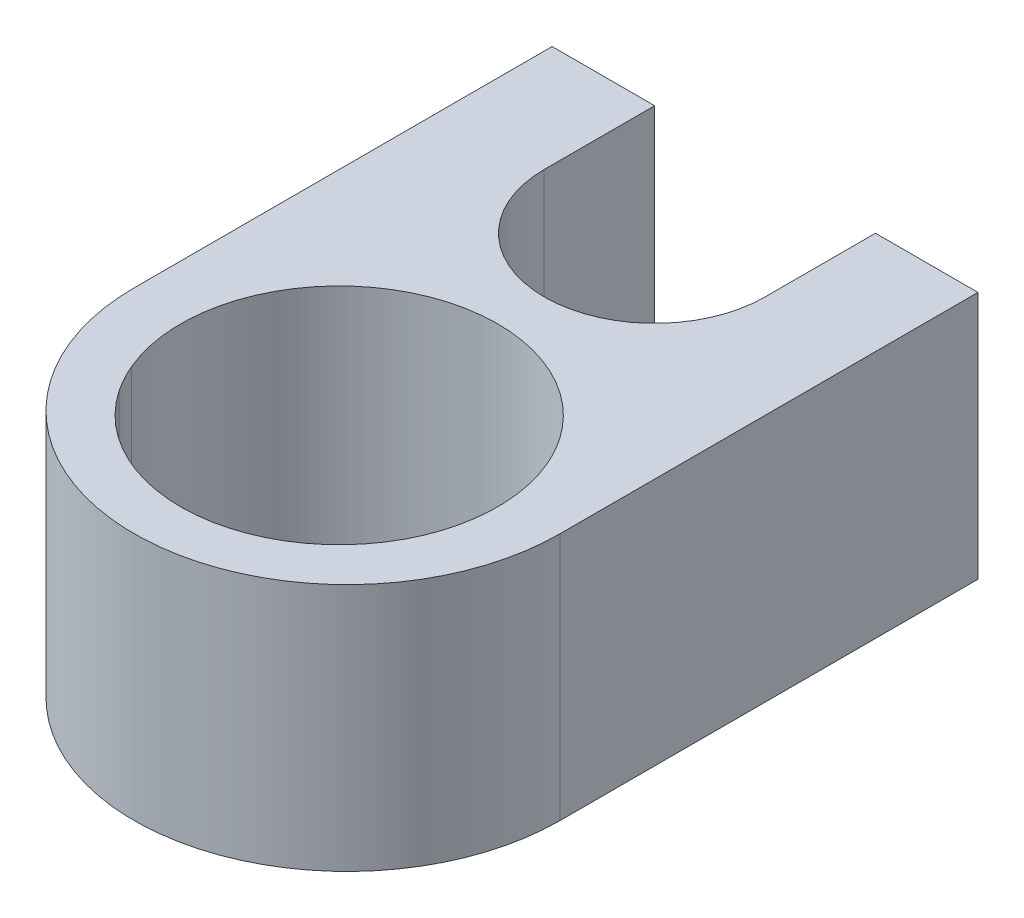
ISO-10303-21;
HEADER;
FILE_DESCRIPTION(('STEP AP214'),'2;1');
FILE_NAME('part.step','',(''),(''),'','','');
FILE_SCHEMA(('AUTOMOTIVE_DESIGN { 1 0 10303 214 1 1 1 1 }'));
ENDSEC;
DATA;
#1=APPLICATION_CONTEXT('core data for automotive mechanical design processes');
#2=APPLICATION_PROTOCOL_DEFINITION('international standard','automotive_design',2000,#1);
#3=PRODUCT_CONTEXT('',#1,'mechanical');
#4=PRODUCT('Part','Part','',(#3));
#5=PRODUCT_RELATED_PRODUCT_CATEGORY('part','',(#4));
#6=PRODUCT_DEFINITION_FORMATION('','',#4);
#7=PRODUCT_DEFINITION_CONTEXT('part definition',#1,'design');
#8=PRODUCT_DEFINITION('design','',#6,#7);
#9=PRODUCT_DEFINITION_SHAPE('','',#8);
#10=(LENGTH_UNIT() NAMED_UNIT(*) SI_UNIT(.MILLI.,.METRE.));
#11=(NAMED_UNIT(*) PLANE_ANGLE_UNIT() SI_UNIT($,.RADIAN.));
#12=(NAMED_UNIT(*) SI_UNIT($,.STERADIAN.) SOLID_ANGLE_UNIT());
#13=UNCERTAINTY_MEASURE_WITH_UNIT(LENGTH_MEASURE(1.E-05),#10,'distance_accuracy_value','');
#14=(GEOMETRIC_REPRESENTATION_CONTEXT(3) GLOBAL_UNCERTAINTY_ASSIGNED_CONTEXT((#13)) GLOBAL_UNIT_ASSIGNED_CONTEXT((#10,
#11,#12)) REPRESENTATION_CONTEXT('',''));
#15=CARTESIAN_POINT('',(0.,0.,0.));
#16=DIRECTION('',(0.,0.,1.));
#17=DIRECTION('',(1.,0.,0.));
#18=AXIS2_PLACEMENT_3D('',#15,#16,#17);
#19=CARTESIAN_POINT('',(0.,15.75,19.));
#20=DIRECTION('',(0.,-1.,0.));
#21=DIRECTION('',(0.,0.,-1.));
#22=AXIS2_PLACEMENT_3D('',#19,#20,#21);
#23=CYLINDRICAL_SURFACE('',#22,20.1);
#24=DIRECTION('',(0.,-1.,0.));
#25=VECTOR('',#24,1.);
#26=CARTESIAN_POINT('',(-16.6027744372895,15.75,30.3295137135045));
#27=LINE('',#26,#25);
#28=CARTESIAN_POINT('',(-16.6027744372896,-15.75,30.3295137135044));
#29=VERTEX_POINT('',#28);
#30=CARTESIAN_POINT('',(-16.6027744372896,15.75,30.3295137135044));
#31=VERTEX_POINT('',#30);
#32=EDGE_CURVE('E11',#29,#31,#27,.F.);
#33=ORIENTED_EDGE('',*,*,#32,.F.);
#34=CARTESIAN_POINT('',(0.,-15.75,19.));
#35=DIRECTION('',(0.,-1.,0.));
#36=DIRECTION('',(0.,0.,-1.));
#37=AXIS2_PLACEMENT_3D('',#34,#35,#36);
#38=CIRCLE('',#37,20.1);
#39=CARTESIAN_POINT('',(-18.5194079123365,-15.75,26.8129079462444));
#40=VERTEX_POINT('',#39);
#41=EDGE_CURVE('E383',#29,#40,#38,.T.);
#42=ORIENTED_EDGE('',*,*,#41,.T.);
#43=DIRECTION('',(0.,-1.,0.));
#44=VECTOR('',#43,1.);
#45=CARTESIAN_POINT('',(-18.5194079123365,15.75,26.8129079462444));
#46=LINE('',#45,#44);
#47=CARTESIAN_POINT('',(-18.5194079123365,15.75,26.8129079462444));
#48=VERTEX_POINT('',#47);
#49=EDGE_CURVE('E50',#48,#40,#46,.T.);
#50=ORIENTED_EDGE('',*,*,#49,.F.);
#51=CARTESIAN_POINT('',(0.,15.75,19.));
#52=DIRECTION('',(0.,-1.,0.));
#53=DIRECTION('',(0.,0.,-1.));
#54=AXIS2_PLACEMENT_3D('',#51,#52,#53);
#55=CIRCLE('',#54,20.1);
#56=EDGE_CURVE('E216',#31,#48,#55,.T.);
#57=ORIENTED_EDGE('',*,*,#56,.F.);
#58=EDGE_LOOP('',(#33,#42,#50,#57));
#59=FACE_BOUND('',#58,.T.);
#60=ADVANCED_FACE('F40',(#59),#23,.F.);
#61=CARTESIAN_POINT('',(18.5194079123366,-15.75,11.1870920537559));
#62=VERTEX_POINT('',#61);
#63=EDGE_CURVE('E226',#62,#29,#38,.T.);
#64=ORIENTED_EDGE('',*,*,#63,.T.);
#65=ORIENTED_EDGE('',*,*,#32,.T.);
#66=CARTESIAN_POINT('',(18.5194079123366,15.75,11.1870920537559));
#67=VERTEX_POINT('',#66);
#68=EDGE_CURVE('E222',#67,#31,#55,.T.);
#69=ORIENTED_EDGE('',*,*,#68,.F.);
#70=DIRECTION('',(0.,-1.,0.));
#71=VECTOR('',#70,1.);
#72=CARTESIAN_POINT('',(18.5194079123366,15.75,11.1870920537559));
#73=LINE('',#72,#71);
#74=EDGE_CURVE('E189',#67,#62,#73,.T.);
#75=ORIENTED_EDGE('',*,*,#74,.T.);
#76=EDGE_LOOP('',(#64,#65,#69,#75));
#77=FACE_BOUND('',#76,.T.);
#78=ADVANCED_FACE('F270',(#77),#23,.F.);
#79=DIRECTION('',(0.,-1.,0.));
#80=VECTOR('',#79,1.);
#81=CARTESIAN_POINT('',(16.6027744372894,15.75,7.67048628649537));
#82=LINE('',#81,#80);
#83=CARTESIAN_POINT('',(16.6027744372894,-15.75,7.67048628649536));
#84=VERTEX_POINT('',#83);
#85=CARTESIAN_POINT('',(16.6027744372894,15.75,7.67048628649536));
#86=VERTEX_POINT('',#85);
#87=EDGE_CURVE('E192',#84,#86,#82,.F.);
#88=ORIENTED_EDGE('',*,*,#87,.F.);
#89=EDGE_CURVE('E217',#84,#62,#38,.T.);
#90=ORIENTED_EDGE('',*,*,#89,.T.);
#91=ORIENTED_EDGE('',*,*,#74,.F.);
#92=EDGE_CURVE('E215',#86,#67,#55,.T.);
#93=ORIENTED_EDGE('',*,*,#92,.F.);
#94=EDGE_LOOP('',(#88,#90,#91,#93));
#95=FACE_BOUND('',#94,.T.);
#96=ADVANCED_FACE('F219',(#95),#23,.F.);
#97=CARTESIAN_POINT('',(0.,-15.75,18.));
#98=DIRECTION('',(0.,-1.,0.));
#99=DIRECTION('',(0.,0.,-1.));
#100=AXIS2_PLACEMENT_3D('',#97,#98,#99);
#101=CYLINDRICAL_SURFACE('',#100,27.);
#102=DIRECTION('',(0.,-1.,0.));
#103=VECTOR('',#102,1.);
#104=CARTESIAN_POINT('',(-27.,-15.75,18.));
#105=LINE('',#104,#103);
#106=CARTESIAN_POINT('',(-27.,-15.75,18.));
#107=VERTEX_POINT('',#106);
#108=CARTESIAN_POINT('',(-27.,15.75,18.));
#109=VERTEX_POINT('',#108);
#110=EDGE_CURVE('E179',#107,#109,#105,.F.);
#111=ORIENTED_EDGE('',*,*,#110,.F.);
#112=CARTESIAN_POINT('',(0.,-15.75,18.));
#113=DIRECTION('',(0.,1.,0.));
#114=DIRECTION('',(0.,0.,1.));
#115=AXIS2_PLACEMENT_3D('',#112,#113,#114);
#116=CIRCLE('',#115,27.);
#117=CARTESIAN_POINT('',(27.,-15.75,18.));
#118=VERTEX_POINT('',#117);
#119=EDGE_CURVE('E185',#118,#107,#116,.F.);
#120=ORIENTED_EDGE('',*,*,#119,.F.);
#121=DIRECTION('',(0.,-1.,0.));
#122=VECTOR('',#121,1.);
#123=CARTESIAN_POINT('',(27.,-15.75,18.));
#124=LINE('',#123,#122);
#125=CARTESIAN_POINT('',(27.,15.75,18.));
#126=VERTEX_POINT('',#125);
#127=EDGE_CURVE('E182',#126,#118,#124,.T.);
#128=ORIENTED_EDGE('',*,*,#127,.F.);
#129=CARTESIAN_POINT('',(0.,15.75,18.));
#130=DIRECTION('',(0.,-1.,0.));
#131=DIRECTION('',(0.,0.,-1.));
#132=AXIS2_PLACEMENT_3D('',#129,#130,#131);
#133=CIRCLE('',#132,27.);
#134=EDGE_CURVE('E187',#109,#126,#133,.F.);
#135=ORIENTED_EDGE('',*,*,#134,.F.);
#136=EDGE_LOOP('',(#111,#120,#128,#135));
#137=FACE_BOUND('',#136,.T.);
#138=ADVANCED_FACE('F43',(#137),#101,.T.);
#139=CARTESIAN_POINT('',(-27.,15.75,45.));
#140=DIRECTION('',(0.,-1.,0.));
#141=DIRECTION('',(0.,0.,-1.));
#142=AXIS2_PLACEMENT_3D('',#139,#140,#141);
#143=PLANE('',#142);
#144=ORIENTED_EDGE('',*,*,#92,.T.);
#145=ORIENTED_EDGE('',*,*,#68,.T.);
#146=ORIENTED_EDGE('',*,*,#56,.T.);
#147=EDGE_CURVE('E205',#48,#86,#55,.T.);
#148=ORIENTED_EDGE('',*,*,#147,.T.);
#149=EDGE_LOOP('',(#144,#145,#146,#148));
#150=FACE_BOUND('',#149,.T.);
#151=DIRECTION('',(0.,0.,-1.));
#152=VECTOR('',#151,1.);
#153=CARTESIAN_POINT('',(-27.,15.75,45.));
#154=LINE('',#153,#152);
#155=CARTESIAN_POINT('',(-27.,15.75,-35.));
#156=VERTEX_POINT('',#155);
#157=EDGE_CURVE('E175',#109,#156,#154,.T.);
#158=ORIENTED_EDGE('',*,*,#157,.F.);
#159=ORIENTED_EDGE('',*,*,#134,.T.);
#160=DIRECTION('',(0.,0.,-1.));
#161=VECTOR('',#160,1.);
#162=CARTESIAN_POINT('',(27.,15.75,45.));
#163=LINE('',#162,#161);
#164=CARTESIAN_POINT('',(27.,15.75,-35.));
#165=VERTEX_POINT('',#164);
#166=EDGE_CURVE('E177',#126,#165,#163,.T.);
#167=ORIENTED_EDGE('',*,*,#166,.T.);
#168=DIRECTION('',(1.,0.,0.));
#169=VECTOR('',#168,1.);
#170=CARTESIAN_POINT('',(-27.,15.75,-35.));
#171=LINE('',#170,#169);
#172=CARTESIAN_POINT('',(14.,15.75,-35.));
#173=VERTEX_POINT('',#172);
#174=EDGE_CURVE('E159',#173,#165,#171,.T.);
#175=ORIENTED_EDGE('',*,*,#174,.F.);
#176=DIRECTION('',(0.,0.,1.));
#177=VECTOR('',#176,1.);
#178=CARTESIAN_POINT('',(14.,15.75,-35.));
#179=LINE('',#178,#177);
#180=CARTESIAN_POINT('',(14.,15.75,-21.));
#181=VERTEX_POINT('',#180);
#182=EDGE_CURVE('E142',#173,#181,#179,.T.);
#183=ORIENTED_EDGE('',*,*,#182,.T.);
#184=CARTESIAN_POINT('',(0.,15.75,-21.));
#185=DIRECTION('',(0.,-1.,0.));
#186=DIRECTION('',(0.,0.,-1.));
#187=AXIS2_PLACEMENT_3D('',#184,#185,#186);
#188=CIRCLE('',#187,14.);
#189=CARTESIAN_POINT('',(-14.,15.75,-21.));
#190=VERTEX_POINT('',#189);
#191=EDGE_CURVE('E151',#181,#190,#188,.T.);
#192=ORIENTED_EDGE('',*,*,#191,.T.);
#193=DIRECTION('',(0.,0.,1.));
#194=VECTOR('',#193,1.);
#195=CARTESIAN_POINT('',(-14.,15.75,-35.));
#196=LINE('',#195,#194);
#197=CARTESIAN_POINT('',(-14.,15.75,-35.));
#198=VERTEX_POINT('',#197);
#199=EDGE_CURVE('E133',#198,#190,#196,.T.);
#200=ORIENTED_EDGE('',*,*,#199,.F.);
#201=EDGE_CURVE('E148',#156,#198,#171,.T.);
#202=ORIENTED_EDGE('',*,*,#201,.F.);
#203=EDGE_LOOP('',(#158,#159,#167,#175,#183,#192,#200,#202));
#204=FACE_BOUND('',#203,.T.);
#205=ADVANCED_FACE('F147',(#150,#204),#143,.F.);
#206=CARTESIAN_POINT('',(-27.,-15.75,45.));
#207=DIRECTION('',(0.,1.,0.));
#208=DIRECTION('',(0.,0.,1.));
#209=AXIS2_PLACEMENT_3D('',#206,#207,#208);
#210=PLANE('',#209);
#211=ORIENTED_EDGE('',*,*,#89,.F.);
#212=EDGE_CURVE('E207',#40,#84,#38,.T.);
#213=ORIENTED_EDGE('',*,*,#212,.F.);
#214=ORIENTED_EDGE('',*,*,#41,.F.);
#215=ORIENTED_EDGE('',*,*,#63,.F.);
#216=EDGE_LOOP('',(#211,#213,#214,#215));
#217=FACE_BOUND('',#216,.T.);
#218=DIRECTION('',(0.,0.,-1.));
#219=VECTOR('',#218,1.);
#220=CARTESIAN_POINT('',(27.,-15.75,45.));
#221=LINE('',#220,#219);
#222=CARTESIAN_POINT('',(27.,-15.75,-35.));
#223=VERTEX_POINT('',#222);
#224=EDGE_CURVE('E171',#118,#223,#221,.T.);
#225=ORIENTED_EDGE('',*,*,#224,.F.);
#226=ORIENTED_EDGE('',*,*,#119,.T.);
#227=DIRECTION('',(0.,0.,-1.));
#228=VECTOR('',#227,1.);
#229=CARTESIAN_POINT('',(-27.,-15.75,45.));
#230=LINE('',#229,#228);
#231=CARTESIAN_POINT('',(-27.,-15.75,-35.));
#232=VERTEX_POINT('',#231);
#233=EDGE_CURVE('E173',#107,#232,#230,.T.);
#234=ORIENTED_EDGE('',*,*,#233,.T.);
#235=DIRECTION('',(-1.,0.,0.));
#236=VECTOR('',#235,1.);
#237=CARTESIAN_POINT('',(27.,-15.75,-35.));
#238=LINE('',#237,#236);
#239=CARTESIAN_POINT('',(-14.,-15.75,-35.));
#240=VERTEX_POINT('',#239);
#241=EDGE_CURVE('E162',#240,#232,#238,.T.);
#242=ORIENTED_EDGE('',*,*,#241,.F.);
#243=DIRECTION('',(0.,0.,-1.));
#244=VECTOR('',#243,1.);
#245=CARTESIAN_POINT('',(-14.,-15.75,-35.));
#246=LINE('',#245,#244);
#247=CARTESIAN_POINT('',(-14.,-15.75,-21.));
#248=VERTEX_POINT('',#247);
#249=EDGE_CURVE('E136',#248,#240,#246,.T.);
#250=ORIENTED_EDGE('',*,*,#249,.F.);
#251=CARTESIAN_POINT('',(0.,-15.75,-21.));
#252=DIRECTION('',(0.,1.,0.));
#253=DIRECTION('',(0.,0.,1.));
#254=AXIS2_PLACEMENT_3D('',#251,#252,#253);
#255=CIRCLE('',#254,14.);
#256=CARTESIAN_POINT('',(14.,-15.75,-21.));
#257=VERTEX_POINT('',#256);
#258=EDGE_CURVE('E221',#248,#257,#255,.T.);
#259=ORIENTED_EDGE('',*,*,#258,.T.);
#260=DIRECTION('',(0.,0.,-1.));
#261=VECTOR('',#260,1.);
#262=CARTESIAN_POINT('',(14.,-15.75,-35.));
#263=LINE('',#262,#261);
#264=CARTESIAN_POINT('',(14.,-15.75,-35.));
#265=VERTEX_POINT('',#264);
#266=EDGE_CURVE('E152',#257,#265,#263,.T.);
#267=ORIENTED_EDGE('',*,*,#266,.T.);
#268=EDGE_CURVE('E167',#223,#265,#238,.T.);
#269=ORIENTED_EDGE('',*,*,#268,.F.);
#270=EDGE_LOOP('',(#225,#226,#234,#242,#250,#259,#267,#269));
#271=FACE_BOUND('',#270,.T.);
#272=ADVANCED_FACE('F243',(#217,#271),#210,.F.);
#273=CARTESIAN_POINT('',(0.,0.,-35.));
#274=DIRECTION('',(0.,0.,-1.));
#275=DIRECTION('',(-1.,0.,0.));
#276=AXIS2_PLACEMENT_3D('',#273,#274,#275);
#277=PLANE('',#276);
#278=ORIENTED_EDGE('',*,*,#268,.T.);
#279=DIRECTION('',(0.,1.,0.));
#280=VECTOR('',#279,1.);
#281=CARTESIAN_POINT('',(14.,-15.751,-35.));
#282=LINE('',#281,#280);
#283=EDGE_CURVE('E232',#265,#173,#282,.T.);
#284=ORIENTED_EDGE('',*,*,#283,.T.);
#285=ORIENTED_EDGE('',*,*,#174,.T.);
#286=DIRECTION('',(0.,-1.,0.));
#287=VECTOR('',#286,1.);
#288=CARTESIAN_POINT('',(27.,15.75,-35.));
#289=LINE('',#288,#287);
#290=EDGE_CURVE('E158',#165,#223,#289,.T.);
#291=ORIENTED_EDGE('',*,*,#290,.T.);
#292=EDGE_LOOP('',(#278,#284,#285,#291));
#293=FACE_BOUND('',#292,.T.);
#294=ADVANCED_FACE('F257',(#293),#277,.T.);
#295=CARTESIAN_POINT('',(27.,-15.75,45.));
#296=DIRECTION('',(-1.,0.,0.));
#297=DIRECTION('',(0.,0.,1.));
#298=AXIS2_PLACEMENT_3D('',#295,#296,#297);
#299=PLANE('',#298);
#300=ORIENTED_EDGE('',*,*,#166,.F.);
#301=ORIENTED_EDGE('',*,*,#127,.T.);
#302=ORIENTED_EDGE('',*,*,#224,.T.);
#303=ORIENTED_EDGE('',*,*,#290,.F.);
#304=EDGE_LOOP('',(#300,#301,#302,#303));
#305=FACE_BOUND('',#304,.T.);
#306=ADVANCED_FACE('F254',(#305),#299,.F.);
#307=CARTESIAN_POINT('',(-27.,-15.75,45.));
#308=DIRECTION('',(1.,0.,0.));
#309=DIRECTION('',(0.,0.,-1.));
#310=AXIS2_PLACEMENT_3D('',#307,#308,#309);
#311=PLANE('',#310);
#312=ORIENTED_EDGE('',*,*,#233,.F.);
#313=ORIENTED_EDGE('',*,*,#110,.T.);
#314=ORIENTED_EDGE('',*,*,#157,.T.);
#315=DIRECTION('',(0.,1.,0.));
#316=VECTOR('',#315,1.);
#317=CARTESIAN_POINT('',(-27.,-15.75,-35.));
#318=LINE('',#317,#316);
#319=EDGE_CURVE('E157',#232,#156,#318,.T.);
#320=ORIENTED_EDGE('',*,*,#319,.F.);
#321=EDGE_LOOP('',(#312,#313,#314,#320));
#322=FACE_BOUND('',#321,.T.);
#323=ADVANCED_FACE('F246',(#322),#311,.F.);
#324=DIRECTION('',(0.,1.,0.));
#325=VECTOR('',#324,1.);
#326=CARTESIAN_POINT('',(-14.,-15.751,-35.));
#327=LINE('',#326,#325);
#328=EDGE_CURVE('E130',#240,#198,#327,.T.);
#329=ORIENTED_EDGE('',*,*,#328,.F.);
#330=ORIENTED_EDGE('',*,*,#241,.T.);
#331=ORIENTED_EDGE('',*,*,#319,.T.);
#332=ORIENTED_EDGE('',*,*,#201,.T.);
#333=EDGE_LOOP('',(#329,#330,#331,#332));
#334=FACE_BOUND('',#333,.T.);
#335=ADVANCED_FACE('F155',(#334),#277,.T.);
#336=CARTESIAN_POINT('',(14.,-15.751,-35.));
#337=DIRECTION('',(-1.,0.,0.));
#338=DIRECTION('',(0.,0.,1.));
#339=AXIS2_PLACEMENT_3D('',#336,#337,#338);
#340=PLANE('',#339);
#341=DIRECTION('',(0.,1.,0.));
#342=VECTOR('',#341,1.);
#343=CARTESIAN_POINT('',(14.,-15.751,-21.));
#344=LINE('',#343,#342);
#345=EDGE_CURVE('E235',#257,#181,#344,.T.);
#346=ORIENTED_EDGE('',*,*,#345,.T.);
#347=ORIENTED_EDGE('',*,*,#182,.F.);
#348=ORIENTED_EDGE('',*,*,#283,.F.);
#349=ORIENTED_EDGE('',*,*,#266,.F.);
#350=EDGE_LOOP('',(#346,#347,#348,#349));
#351=FACE_BOUND('',#350,.T.);
#352=ADVANCED_FACE('F259',(#351),#340,.T.);
#353=CARTESIAN_POINT('',(0.,-15.751,-21.));
#354=DIRECTION('',(0.,1.,0.));
#355=DIRECTION('',(0.,0.,1.));
#356=AXIS2_PLACEMENT_3D('',#353,#354,#355);
#357=CYLINDRICAL_SURFACE('',#356,14.);
#358=DIRECTION('',(0.,1.,0.));
#359=VECTOR('',#358,1.);
#360=CARTESIAN_POINT('',(-14.,-15.751,-21.));
#361=LINE('',#360,#359);
#362=EDGE_CURVE('E141',#248,#190,#361,.T.);
#363=ORIENTED_EDGE('',*,*,#362,.T.);
#364=ORIENTED_EDGE('',*,*,#191,.F.);
#365=ORIENTED_EDGE('',*,*,#345,.F.);
#366=ORIENTED_EDGE('',*,*,#258,.F.);
#367=EDGE_LOOP('',(#363,#364,#365,#366));
#368=FACE_BOUND('',#367,.T.);
#369=ADVANCED_FACE('F239',(#368),#357,.F.);
#370=CARTESIAN_POINT('',(-14.,-15.751,-35.));
#371=DIRECTION('',(-1.,0.,0.));
#372=DIRECTION('',(0.,0.,1.));
#373=AXIS2_PLACEMENT_3D('',#370,#371,#372);
#374=PLANE('',#373);
#375=ORIENTED_EDGE('',*,*,#249,.T.);
#376=ORIENTED_EDGE('',*,*,#328,.T.);
#377=ORIENTED_EDGE('',*,*,#199,.T.);
#378=ORIENTED_EDGE('',*,*,#362,.F.);
#379=EDGE_LOOP('',(#375,#376,#377,#378));
#380=FACE_BOUND('',#379,.T.);
#381=ADVANCED_FACE('F132',(#380),#374,.F.);
#382=ORIENTED_EDGE('',*,*,#147,.F.);
#383=ORIENTED_EDGE('',*,*,#49,.T.);
#384=ORIENTED_EDGE('',*,*,#212,.T.);
#385=ORIENTED_EDGE('',*,*,#87,.T.);
#386=EDGE_LOOP('',(#382,#383,#384,#385));
#387=FACE_BOUND('',#386,.T.);
#388=ADVANCED_FACE('F204',(#387),#23,.F.);
#389=CLOSED_SHELL('',(#60,#78,#96,#138,#205,#272,#294,#306,#323,#335,#352,#369,#381,#388));
#390=MANIFOLD_SOLID_BREP('B2',#389);
#391=ADVANCED_BREP_SHAPE_REPRESENTATION('',(#18,#390),#14);
#392=SHAPE_DEFINITION_REPRESENTATION(#9,#391);
ENDSEC;
END-ISO-10303-21;
